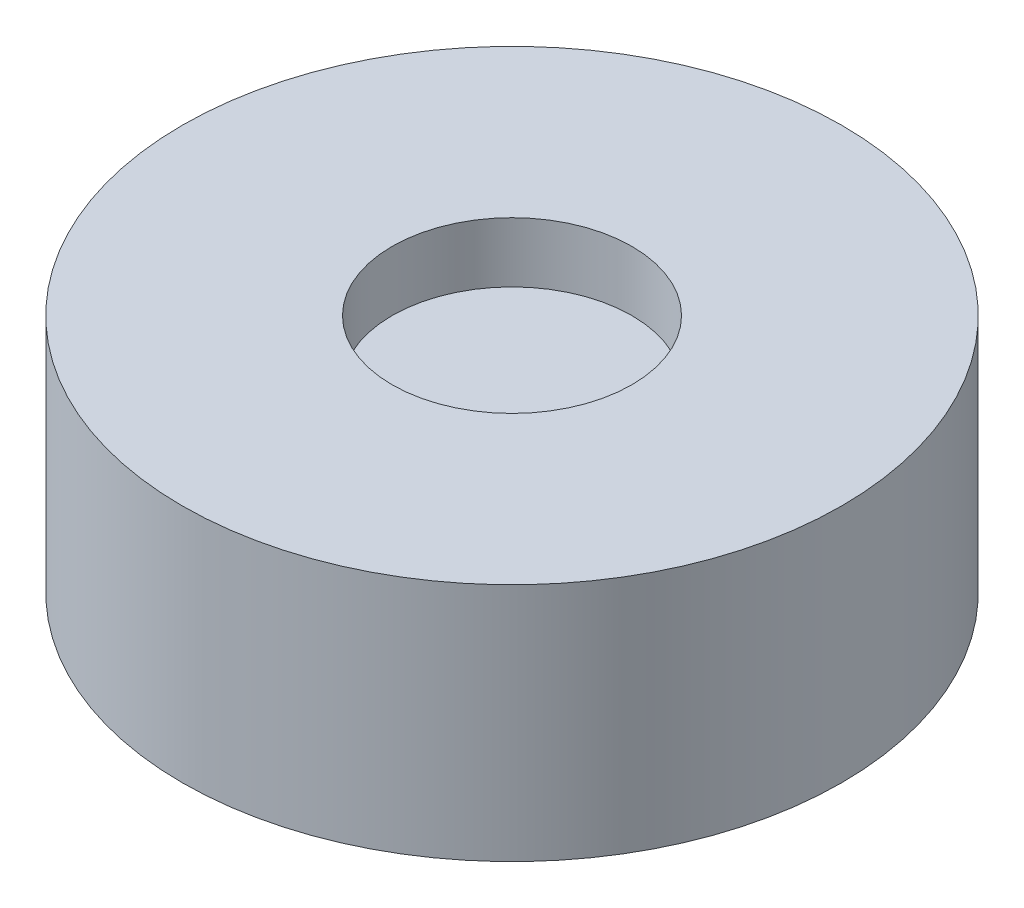
ISO-10303-21;
HEADER;
FILE_DESCRIPTION(('STEP AP214'),'2;1');
FILE_NAME('part.step','',(''),(''),'','','');
FILE_SCHEMA(('AUTOMOTIVE_DESIGN { 1 0 10303 214 1 1 1 1 }'));
ENDSEC;
DATA;
#1=APPLICATION_CONTEXT('core data for automotive mechanical design processes');
#2=APPLICATION_PROTOCOL_DEFINITION('international standard','automotive_design',2000,#1);
#3=PRODUCT_CONTEXT('',#1,'mechanical');
#4=PRODUCT('Part','Part','',(#3));
#5=PRODUCT_RELATED_PRODUCT_CATEGORY('part','',(#4));
#6=PRODUCT_DEFINITION_FORMATION('','',#4);
#7=PRODUCT_DEFINITION_CONTEXT('part definition',#1,'design');
#8=PRODUCT_DEFINITION('design','',#6,#7);
#9=PRODUCT_DEFINITION_SHAPE('','',#8);
#10=(LENGTH_UNIT() NAMED_UNIT(*) SI_UNIT(.MILLI.,.METRE.));
#11=(NAMED_UNIT(*) PLANE_ANGLE_UNIT() SI_UNIT($,.RADIAN.));
#12=(NAMED_UNIT(*) SI_UNIT($,.STERADIAN.) SOLID_ANGLE_UNIT());
#13=UNCERTAINTY_MEASURE_WITH_UNIT(LENGTH_MEASURE(1.E-05),#10,'distance_accuracy_value','');
#14=(GEOMETRIC_REPRESENTATION_CONTEXT(3) GLOBAL_UNCERTAINTY_ASSIGNED_CONTEXT((#13)) GLOBAL_UNIT_ASSIGNED_CONTEXT((#10,
#11,#12)) REPRESENTATION_CONTEXT('',''));
#15=CARTESIAN_POINT('',(0.,0.,0.));
#16=DIRECTION('',(0.,0.,1.));
#17=DIRECTION('',(1.,0.,0.));
#18=AXIS2_PLACEMENT_3D('',#15,#16,#17);
#19=CARTESIAN_POINT('',(0.,0.,0.));
#20=DIRECTION('',(0.,1.,0.));
#21=DIRECTION('',(0.,0.,1.));
#22=AXIS2_PLACEMENT_3D('',#19,#20,#21);
#23=PLANE('',#22);
#24=CARTESIAN_POINT('',(0.,0.,0.));
#25=DIRECTION('',(0.,1.,0.));
#26=DIRECTION('',(0.,0.,1.));
#27=AXIS2_PLACEMENT_3D('',#24,#25,#26);
#28=CIRCLE('',#27,5.5);
#29=CARTESIAN_POINT('',(0.,0.,5.5));
#30=VERTEX_POINT('',#29);
#31=EDGE_CURVE('E46',#30,#30,#28,.T.);
#32=ORIENTED_EDGE('',*,*,#31,.F.);
#33=EDGE_LOOP('',(#32));
#34=FACE_BOUND('',#33,.T.);
#35=CARTESIAN_POINT('',(0.,0.,0.));
#36=DIRECTION('',(0.,1.,0.));
#37=DIRECTION('',(0.,0.,1.));
#38=AXIS2_PLACEMENT_3D('',#35,#36,#37);
#39=CIRCLE('',#38,4.15);
#40=CARTESIAN_POINT('',(0.,0.,4.15));
#41=VERTEX_POINT('',#40);
#42=EDGE_CURVE('E50',#41,#41,#39,.T.);
#43=ORIENTED_EDGE('',*,*,#42,.T.);
#44=EDGE_LOOP('',(#43));
#45=FACE_BOUND('',#44,.T.);
#46=ADVANCED_FACE('F39',(#34,#45),#23,.F.);
#47=CARTESIAN_POINT('',(0.,3.,0.));
#48=DIRECTION('',(0.,-1.,0.));
#49=DIRECTION('',(0.,0.,-1.));
#50=AXIS2_PLACEMENT_3D('',#47,#48,#49);
#51=CYLINDRICAL_SURFACE('',#50,5.5);
#52=ORIENTED_EDGE('',*,*,#31,.T.);
#53=EDGE_LOOP('',(#52));
#54=FACE_BOUND('',#53,.T.);
#55=CARTESIAN_POINT('',(0.,4.,0.));
#56=DIRECTION('',(0.,1.,0.));
#57=DIRECTION('',(0.,0.,1.));
#58=AXIS2_PLACEMENT_3D('',#55,#56,#57);
#59=CIRCLE('',#58,5.5);
#60=CARTESIAN_POINT('',(0.,4.,5.5));
#61=VERTEX_POINT('',#60);
#62=EDGE_CURVE('E54',#61,#61,#59,.T.);
#63=ORIENTED_EDGE('',*,*,#62,.F.);
#64=EDGE_LOOP('',(#63));
#65=FACE_BOUND('',#64,.T.);
#66=ADVANCED_FACE('F41',(#54,#65),#51,.T.);
#67=CARTESIAN_POINT('',(0.,3.,0.));
#68=DIRECTION('',(0.,-1.,0.));
#69=DIRECTION('',(0.,0.,-1.));
#70=AXIS2_PLACEMENT_3D('',#67,#68,#69);
#71=CYLINDRICAL_SURFACE('',#70,4.15);
#72=CARTESIAN_POINT('',(0.,2.,0.));
#73=DIRECTION('',(0.,-1.,0.));
#74=DIRECTION('',(0.,0.,-1.));
#75=AXIS2_PLACEMENT_3D('',#72,#73,#74);
#76=CIRCLE('',#75,4.15);
#77=CARTESIAN_POINT('',(0.,2.,-4.15));
#78=VERTEX_POINT('',#77);
#79=EDGE_CURVE('E10',#78,#78,#76,.T.);
#80=ORIENTED_EDGE('',*,*,#79,.F.);
#81=EDGE_LOOP('',(#80));
#82=FACE_BOUND('',#81,.T.);
#83=ORIENTED_EDGE('',*,*,#42,.F.);
#84=EDGE_LOOP('',(#83));
#85=FACE_BOUND('',#84,.T.);
#86=ADVANCED_FACE('F71',(#82,#85),#71,.F.);
#87=CARTESIAN_POINT('',(0.,4.,0.));
#88=DIRECTION('',(0.,1.,0.));
#89=DIRECTION('',(0.,0.,1.));
#90=AXIS2_PLACEMENT_3D('',#87,#88,#89);
#91=PLANE('',#90);
#92=ORIENTED_EDGE('',*,*,#62,.T.);
#93=EDGE_LOOP('',(#92));
#94=FACE_BOUND('',#93,.T.);
#95=CARTESIAN_POINT('',(0.,4.,0.));
#96=DIRECTION('',(0.,1.,0.));
#97=DIRECTION('',(0.,0.,1.));
#98=AXIS2_PLACEMENT_3D('',#95,#96,#97);
#99=CIRCLE('',#98,2.);
#100=CARTESIAN_POINT('',(0.,4.,2.));
#101=VERTEX_POINT('',#100);
#102=EDGE_CURVE('E59',#101,#101,#99,.T.);
#103=ORIENTED_EDGE('',*,*,#102,.F.);
#104=EDGE_LOOP('',(#103));
#105=FACE_BOUND('',#104,.T.);
#106=ADVANCED_FACE('F69',(#94,#105),#91,.T.);
#107=CARTESIAN_POINT('',(0.,4.,0.));
#108=DIRECTION('',(0.,-1.,0.));
#109=DIRECTION('',(0.,0.,-1.));
#110=AXIS2_PLACEMENT_3D('',#107,#108,#109);
#111=CYLINDRICAL_SURFACE('',#110,2.);
#112=ORIENTED_EDGE('',*,*,#102,.T.);
#113=EDGE_LOOP('',(#112));
#114=FACE_BOUND('',#113,.T.);
#115=CARTESIAN_POINT('',(0.,3.,0.));
#116=DIRECTION('',(0.,1.,0.));
#117=DIRECTION('',(0.,0.,1.));
#118=AXIS2_PLACEMENT_3D('',#115,#116,#117);
#119=CIRCLE('',#118,2.);
#120=CARTESIAN_POINT('',(0.,3.,2.));
#121=VERTEX_POINT('',#120);
#122=EDGE_CURVE('E60',#121,#121,#119,.T.);
#123=ORIENTED_EDGE('',*,*,#122,.F.);
#124=EDGE_LOOP('',(#123));
#125=FACE_BOUND('',#124,.T.);
#126=ADVANCED_FACE('F66',(#114,#125),#111,.F.);
#127=CARTESIAN_POINT('',(0.,3.,0.));
#128=DIRECTION('',(0.,-1.,0.));
#129=DIRECTION('',(0.,0.,-1.));
#130=AXIS2_PLACEMENT_3D('',#127,#128,#129);
#131=PLANE('',#130);
#132=ORIENTED_EDGE('',*,*,#122,.T.);
#133=EDGE_LOOP('',(#132));
#134=FACE_BOUND('',#133,.T.);
#135=ADVANCED_FACE('F78',(#134),#131,.F.);
#136=CARTESIAN_POINT('',(0.,2.,0.));
#137=DIRECTION('',(0.,-1.,0.));
#138=DIRECTION('',(0.,0.,-1.));
#139=AXIS2_PLACEMENT_3D('',#136,#137,#138);
#140=PLANE('',#139);
#141=ORIENTED_EDGE('',*,*,#79,.T.);
#142=EDGE_LOOP('',(#141));
#143=FACE_BOUND('',#142,.T.);
#144=ADVANCED_FACE('F120',(#143),#140,.T.);
#145=CLOSED_SHELL('',(#46,#66,#86,#106,#126,#135,#144));
#146=MANIFOLD_SOLID_BREP('B2',#145);
#147=ADVANCED_BREP_SHAPE_REPRESENTATION('',(#18,#146),#14);
#148=SHAPE_DEFINITION_REPRESENTATION(#9,#147);
ENDSEC;
END-ISO-10303-21;
